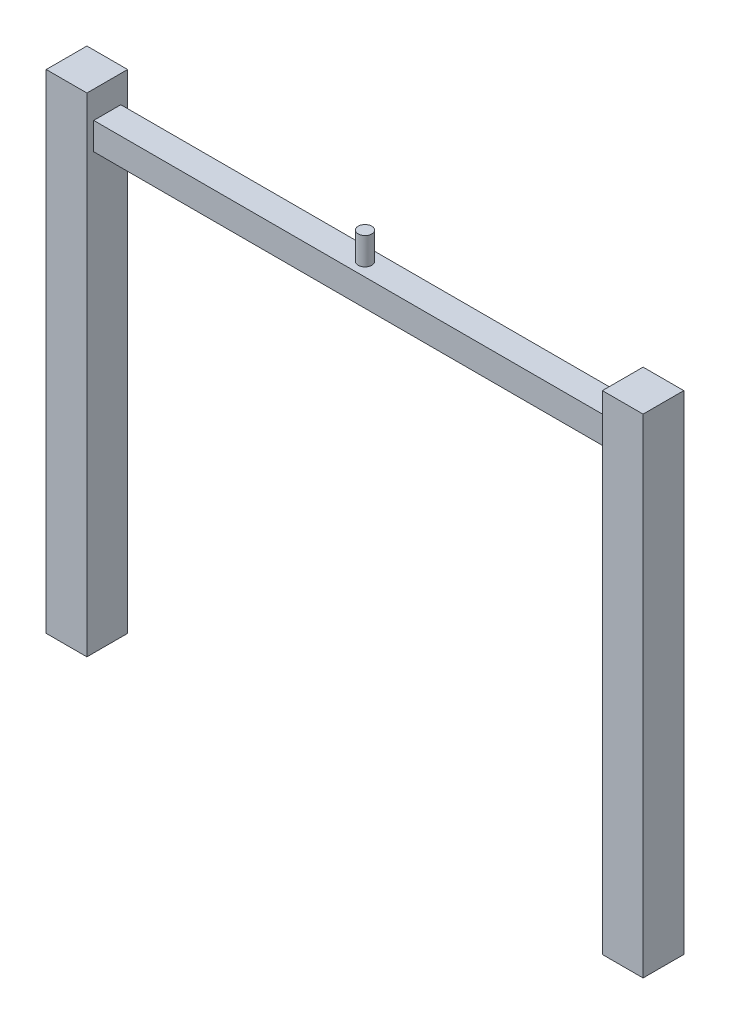
ISO-10303-21;
HEADER;
FILE_DESCRIPTION(('STEP AP214'),'2;1');
FILE_NAME('part.step','',(''),(''),'','','');
FILE_SCHEMA(('AUTOMOTIVE_DESIGN { 1 0 10303 214 1 1 1 1 }'));
ENDSEC;
DATA;
#1=APPLICATION_CONTEXT('core data for automotive mechanical design processes');
#2=APPLICATION_PROTOCOL_DEFINITION('international standard','automotive_design',2000,#1);
#3=PRODUCT_CONTEXT('',#1,'mechanical');
#4=PRODUCT('Part','Part','',(#3));
#5=PRODUCT_RELATED_PRODUCT_CATEGORY('part','',(#4));
#6=PRODUCT_DEFINITION_FORMATION('','',#4);
#7=PRODUCT_DEFINITION_CONTEXT('part definition',#1,'design');
#8=PRODUCT_DEFINITION('design','',#6,#7);
#9=PRODUCT_DEFINITION_SHAPE('','',#8);
#10=(LENGTH_UNIT() NAMED_UNIT(*) SI_UNIT(.MILLI.,.METRE.));
#11=(NAMED_UNIT(*) PLANE_ANGLE_UNIT() SI_UNIT($,.RADIAN.));
#12=(NAMED_UNIT(*) SI_UNIT($,.STERADIAN.) SOLID_ANGLE_UNIT());
#13=UNCERTAINTY_MEASURE_WITH_UNIT(LENGTH_MEASURE(1.E-05),#10,'distance_accuracy_value','');
#14=(GEOMETRIC_REPRESENTATION_CONTEXT(3) GLOBAL_UNCERTAINTY_ASSIGNED_CONTEXT((#13)) GLOBAL_UNIT_ASSIGNED_CONTEXT((#10,
#11,#12)) REPRESENTATION_CONTEXT('',''));
#15=CARTESIAN_POINT('',(0.,0.,0.));
#16=DIRECTION('',(0.,0.,1.));
#17=DIRECTION('',(1.,0.,0.));
#18=AXIS2_PLACEMENT_3D('',#15,#16,#17);
#19=CARTESIAN_POINT('',(-242.569999999999,431.8,-12.7));
#20=DIRECTION('',(0.,0.,-1.));
#21=DIRECTION('',(0.,1.,0.));
#22=AXIS2_PLACEMENT_3D('',#19,#20,#21);
#23=PLANE('',#22);
#24=DIRECTION('',(1.,0.,0.));
#25=VECTOR('',#24,1.);
#26=CARTESIAN_POINT('',(-242.569999999999,431.8,-12.7));
#27=LINE('',#26,#25);
#28=CARTESIAN_POINT('',(-241.299999999999,431.8,-12.7));
#29=VERTEX_POINT('',#28);
#30=CARTESIAN_POINT('',(241.300000000001,431.8,-12.7));
#31=VERTEX_POINT('',#30);
#32=EDGE_CURVE('E57',#29,#31,#27,.T.);
#33=ORIENTED_EDGE('',*,*,#32,.T.);
#34=DIRECTION('',(0.,-1.,0.));
#35=VECTOR('',#34,1.);
#36=CARTESIAN_POINT('',(241.300000000001,431.8,-12.7));
#37=LINE('',#36,#35);
#38=CARTESIAN_POINT('',(241.300000000001,406.4,-12.7));
#39=VERTEX_POINT('',#38);
#40=EDGE_CURVE('E51',#31,#39,#37,.T.);
#41=ORIENTED_EDGE('',*,*,#40,.T.);
#42=DIRECTION('',(1.,0.,0.));
#43=VECTOR('',#42,1.);
#44=CARTESIAN_POINT('',(-242.569999999999,406.4,-12.7));
#45=LINE('',#44,#43);
#46=CARTESIAN_POINT('',(-241.299999999999,406.4,-12.7));
#47=VERTEX_POINT('',#46);
#48=EDGE_CURVE('E161',#47,#39,#45,.T.);
#49=ORIENTED_EDGE('',*,*,#48,.F.);
#50=DIRECTION('',(0.,-1.,0.));
#51=VECTOR('',#50,1.);
#52=CARTESIAN_POINT('',(-241.299999999999,457.2,-12.7));
#53=LINE('',#52,#51);
#54=EDGE_CURVE('E44',#29,#47,#53,.T.);
#55=ORIENTED_EDGE('',*,*,#54,.F.);
#56=EDGE_LOOP('',(#33,#41,#49,#55));
#57=FACE_BOUND('',#56,.T.);
#58=ADVANCED_FACE('F36',(#57),#23,.T.);
#59=CARTESIAN_POINT('',(-242.569999999999,406.4,12.7));
#60=DIRECTION('',(0.,-1.,0.));
#61=DIRECTION('',(0.,0.,-1.));
#62=AXIS2_PLACEMENT_3D('',#59,#60,#61);
#63=PLANE('',#62);
#64=ORIENTED_EDGE('',*,*,#48,.T.);
#65=DIRECTION('',(0.,0.,1.));
#66=VECTOR('',#65,1.);
#67=CARTESIAN_POINT('',(241.300000000001,406.4,12.7));
#68=LINE('',#67,#66);
#69=CARTESIAN_POINT('',(241.300000000001,406.4,12.7));
#70=VERTEX_POINT('',#69);
#71=EDGE_CURVE('E152',#39,#70,#68,.T.);
#72=ORIENTED_EDGE('',*,*,#71,.T.);
#73=DIRECTION('',(1.,0.,0.));
#74=VECTOR('',#73,1.);
#75=CARTESIAN_POINT('',(-242.569999999999,406.4,12.7));
#76=LINE('',#75,#74);
#77=CARTESIAN_POINT('',(-241.299999999999,406.4,12.7));
#78=VERTEX_POINT('',#77);
#79=EDGE_CURVE('E165',#78,#70,#76,.T.);
#80=ORIENTED_EDGE('',*,*,#79,.F.);
#81=DIRECTION('',(0.,0.,1.));
#82=VECTOR('',#81,1.);
#83=CARTESIAN_POINT('',(-241.299999999999,406.4,-19.05));
#84=LINE('',#83,#82);
#85=EDGE_CURVE('E207',#47,#78,#84,.T.);
#86=ORIENTED_EDGE('',*,*,#85,.F.);
#87=EDGE_LOOP('',(#64,#72,#80,#86));
#88=FACE_BOUND('',#87,.T.);
#89=ADVANCED_FACE('F215',(#88),#63,.T.);
#90=CARTESIAN_POINT('',(-242.569999999999,431.8,12.7));
#91=DIRECTION('',(0.,0.,1.));
#92=DIRECTION('',(0.,-1.,0.));
#93=AXIS2_PLACEMENT_3D('',#90,#91,#92);
#94=PLANE('',#93);
#95=ORIENTED_EDGE('',*,*,#79,.T.);
#96=DIRECTION('',(0.,1.,0.));
#97=VECTOR('',#96,1.);
#98=CARTESIAN_POINT('',(241.300000000001,431.8,12.7));
#99=LINE('',#98,#97);
#100=CARTESIAN_POINT('',(241.300000000001,431.8,12.7));
#101=VERTEX_POINT('',#100);
#102=EDGE_CURVE('E149',#70,#101,#99,.T.);
#103=ORIENTED_EDGE('',*,*,#102,.T.);
#104=DIRECTION('',(1.,0.,0.));
#105=VECTOR('',#104,1.);
#106=CARTESIAN_POINT('',(-242.569999999999,431.8,12.7));
#107=LINE('',#106,#105);
#108=CARTESIAN_POINT('',(-241.299999999999,431.8,12.7));
#109=VERTEX_POINT('',#108);
#110=EDGE_CURVE('E168',#109,#101,#107,.T.);
#111=ORIENTED_EDGE('',*,*,#110,.F.);
#112=DIRECTION('',(0.,1.,0.));
#113=VECTOR('',#112,1.);
#114=CARTESIAN_POINT('',(-241.299999999999,457.2,12.7));
#115=LINE('',#114,#113);
#116=EDGE_CURVE('E204',#78,#109,#115,.T.);
#117=ORIENTED_EDGE('',*,*,#116,.F.);
#118=EDGE_LOOP('',(#95,#103,#111,#117));
#119=FACE_BOUND('',#118,.T.);
#120=ADVANCED_FACE('F218',(#119),#94,.T.);
#121=CARTESIAN_POINT('',(-242.569999999999,431.8,12.7));
#122=DIRECTION('',(0.,1.,0.));
#123=DIRECTION('',(0.,0.,1.));
#124=AXIS2_PLACEMENT_3D('',#121,#122,#123);
#125=PLANE('',#124);
#126=CARTESIAN_POINT('',(0.,431.8,0.));
#127=DIRECTION('',(0.,1.,0.));
#128=DIRECTION('',(0.,0.,1.));
#129=AXIS2_PLACEMENT_3D('',#126,#127,#128);
#130=CIRCLE('',#129,6.35);
#131=CARTESIAN_POINT('',(0.,431.8,6.35));
#132=VERTEX_POINT('',#131);
#133=EDGE_CURVE('E245',#132,#132,#130,.T.);
#134=ORIENTED_EDGE('',*,*,#133,.F.);
#135=EDGE_LOOP('',(#134));
#136=FACE_BOUND('',#135,.T.);
#137=ORIENTED_EDGE('',*,*,#110,.T.);
#138=DIRECTION('',(0.,0.,-1.));
#139=VECTOR('',#138,1.);
#140=CARTESIAN_POINT('',(241.300000000001,431.8,12.7));
#141=LINE('',#140,#139);
#142=EDGE_CURVE('E11',#101,#31,#141,.T.);
#143=ORIENTED_EDGE('',*,*,#142,.T.);
#144=ORIENTED_EDGE('',*,*,#32,.F.);
#145=DIRECTION('',(0.,0.,-1.));
#146=VECTOR('',#145,1.);
#147=CARTESIAN_POINT('',(-241.299999999999,431.8,-19.05));
#148=LINE('',#147,#146);
#149=EDGE_CURVE('E201',#109,#29,#148,.T.);
#150=ORIENTED_EDGE('',*,*,#149,.F.);
#151=EDGE_LOOP('',(#137,#143,#144,#150));
#152=FACE_BOUND('',#151,.T.);
#153=ADVANCED_FACE('F220',(#136,#152),#125,.T.);
#154=CARTESIAN_POINT('',(-241.299999999999,457.2,-19.05));
#155=DIRECTION('',(-1.,0.,0.));
#156=DIRECTION('',(0.,0.,1.));
#157=AXIS2_PLACEMENT_3D('',#154,#155,#156);
#158=PLANE('',#157);
#159=ORIENTED_EDGE('',*,*,#149,.T.);
#160=ORIENTED_EDGE('',*,*,#54,.T.);
#161=ORIENTED_EDGE('',*,*,#85,.T.);
#162=ORIENTED_EDGE('',*,*,#116,.T.);
#163=EDGE_LOOP('',(#159,#160,#161,#162));
#164=FACE_BOUND('',#163,.T.);
#165=DIRECTION('',(0.,0.,-1.));
#166=VECTOR('',#165,1.);
#167=CARTESIAN_POINT('',(-241.299999999999,0.,-19.05));
#168=LINE('',#167,#166);
#169=CARTESIAN_POINT('',(-241.299999999999,0.,19.05));
#170=VERTEX_POINT('',#169);
#171=CARTESIAN_POINT('',(-241.299999999999,0.,-19.05));
#172=VERTEX_POINT('',#171);
#173=EDGE_CURVE('E164',#170,#172,#168,.T.);
#174=ORIENTED_EDGE('',*,*,#173,.T.);
#175=DIRECTION('',(0.,-1.,0.));
#176=VECTOR('',#175,1.);
#177=CARTESIAN_POINT('',(-241.299999999999,457.2,-19.05));
#178=LINE('',#177,#176);
#179=CARTESIAN_POINT('',(-241.299999999999,457.2,-19.05));
#180=VERTEX_POINT('',#179);
#181=EDGE_CURVE('E198',#180,#172,#178,.T.);
#182=ORIENTED_EDGE('',*,*,#181,.F.);
#183=DIRECTION('',(0.,0.,-1.));
#184=VECTOR('',#183,1.);
#185=CARTESIAN_POINT('',(-241.299999999999,457.2,-19.05));
#186=LINE('',#185,#184);
#187=CARTESIAN_POINT('',(-241.299999999999,457.2,19.05));
#188=VERTEX_POINT('',#187);
#189=EDGE_CURVE('E172',#188,#180,#186,.T.);
#190=ORIENTED_EDGE('',*,*,#189,.F.);
#191=DIRECTION('',(0.,-1.,0.));
#192=VECTOR('',#191,1.);
#193=CARTESIAN_POINT('',(-241.299999999999,457.2,19.05));
#194=LINE('',#193,#192);
#195=EDGE_CURVE('E182',#188,#170,#194,.T.);
#196=ORIENTED_EDGE('',*,*,#195,.T.);
#197=EDGE_LOOP('',(#174,#182,#190,#196));
#198=FACE_BOUND('',#197,.T.);
#199=ADVANCED_FACE('F38',(#164,#198),#158,.F.);
#200=CARTESIAN_POINT('',(-279.400000000003,457.2,-19.05));
#201=DIRECTION('',(0.,0.,1.));
#202=DIRECTION('',(1.,0.,0.));
#203=AXIS2_PLACEMENT_3D('',#200,#201,#202);
#204=PLANE('',#203);
#205=DIRECTION('',(-1.,0.,0.));
#206=VECTOR('',#205,1.);
#207=CARTESIAN_POINT('',(-279.400000000003,0.,-19.05));
#208=LINE('',#207,#206);
#209=CARTESIAN_POINT('',(-279.400000000003,0.,-19.05));
#210=VERTEX_POINT('',#209);
#211=EDGE_CURVE('E185',#172,#210,#208,.T.);
#212=ORIENTED_EDGE('',*,*,#211,.T.);
#213=DIRECTION('',(0.,-1.,0.));
#214=VECTOR('',#213,1.);
#215=CARTESIAN_POINT('',(-279.400000000003,457.2,-19.05));
#216=LINE('',#215,#214);
#217=CARTESIAN_POINT('',(-279.400000000003,457.2,-19.05));
#218=VERTEX_POINT('',#217);
#219=EDGE_CURVE('E195',#218,#210,#216,.T.);
#220=ORIENTED_EDGE('',*,*,#219,.F.);
#221=DIRECTION('',(-1.,0.,0.));
#222=VECTOR('',#221,1.);
#223=CARTESIAN_POINT('',(-279.400000000003,457.2,-19.05));
#224=LINE('',#223,#222);
#225=EDGE_CURVE('E175',#180,#218,#224,.T.);
#226=ORIENTED_EDGE('',*,*,#225,.F.);
#227=ORIENTED_EDGE('',*,*,#181,.T.);
#228=EDGE_LOOP('',(#212,#220,#226,#227));
#229=FACE_BOUND('',#228,.T.);
#230=ADVANCED_FACE('F261',(#229),#204,.F.);
#231=CARTESIAN_POINT('',(-279.400000000003,457.2,-19.05));
#232=DIRECTION('',(1.,0.,0.));
#233=DIRECTION('',(0.,0.,-1.));
#234=AXIS2_PLACEMENT_3D('',#231,#232,#233);
#235=PLANE('',#234);
#236=DIRECTION('',(0.,0.,1.));
#237=VECTOR('',#236,1.);
#238=CARTESIAN_POINT('',(-279.400000000003,0.,-19.05));
#239=LINE('',#238,#237);
#240=CARTESIAN_POINT('',(-279.400000000003,0.,19.05));
#241=VERTEX_POINT('',#240);
#242=EDGE_CURVE('E187',#210,#241,#239,.T.);
#243=ORIENTED_EDGE('',*,*,#242,.T.);
#244=DIRECTION('',(0.,-1.,0.));
#245=VECTOR('',#244,1.);
#246=CARTESIAN_POINT('',(-279.400000000003,457.2,19.05));
#247=LINE('',#246,#245);
#248=CARTESIAN_POINT('',(-279.400000000003,457.2,19.05));
#249=VERTEX_POINT('',#248);
#250=EDGE_CURVE('E192',#249,#241,#247,.T.);
#251=ORIENTED_EDGE('',*,*,#250,.F.);
#252=DIRECTION('',(0.,0.,1.));
#253=VECTOR('',#252,1.);
#254=CARTESIAN_POINT('',(-279.400000000003,457.2,-19.05));
#255=LINE('',#254,#253);
#256=EDGE_CURVE('E178',#218,#249,#255,.T.);
#257=ORIENTED_EDGE('',*,*,#256,.F.);
#258=ORIENTED_EDGE('',*,*,#219,.T.);
#259=EDGE_LOOP('',(#243,#251,#257,#258));
#260=FACE_BOUND('',#259,.T.);
#261=ADVANCED_FACE('F281',(#260),#235,.F.);
#262=CARTESIAN_POINT('',(-279.400000000003,457.2,19.05));
#263=DIRECTION('',(0.,0.,-1.));
#264=DIRECTION('',(-1.,0.,0.));
#265=AXIS2_PLACEMENT_3D('',#262,#263,#264);
#266=PLANE('',#265);
#267=DIRECTION('',(1.,0.,0.));
#268=VECTOR('',#267,1.);
#269=CARTESIAN_POINT('',(-279.400000000003,0.,19.05));
#270=LINE('',#269,#268);
#271=EDGE_CURVE('E176',#241,#170,#270,.T.);
#272=ORIENTED_EDGE('',*,*,#271,.T.);
#273=ORIENTED_EDGE('',*,*,#195,.F.);
#274=DIRECTION('',(1.,0.,0.));
#275=VECTOR('',#274,1.);
#276=CARTESIAN_POINT('',(-279.400000000003,457.2,19.05));
#277=LINE('',#276,#275);
#278=EDGE_CURVE('E180',#249,#188,#277,.T.);
#279=ORIENTED_EDGE('',*,*,#278,.F.);
#280=ORIENTED_EDGE('',*,*,#250,.T.);
#281=EDGE_LOOP('',(#272,#273,#279,#280));
#282=FACE_BOUND('',#281,.T.);
#283=ADVANCED_FACE('F274',(#282),#266,.F.);
#284=CARTESIAN_POINT('',(0.,457.2,0.));
#285=DIRECTION('',(0.,1.,0.));
#286=DIRECTION('',(0.,0.,1.));
#287=AXIS2_PLACEMENT_3D('',#284,#285,#286);
#288=PLANE('',#287);
#289=ORIENTED_EDGE('',*,*,#189,.T.);
#290=ORIENTED_EDGE('',*,*,#225,.T.);
#291=ORIENTED_EDGE('',*,*,#256,.T.);
#292=ORIENTED_EDGE('',*,*,#278,.T.);
#293=EDGE_LOOP('',(#289,#290,#291,#292));
#294=FACE_BOUND('',#293,.T.);
#295=ADVANCED_FACE('F270',(#294),#288,.T.);
#296=CARTESIAN_POINT('',(0.,0.,0.));
#297=DIRECTION('',(0.,1.,0.));
#298=DIRECTION('',(0.,0.,1.));
#299=AXIS2_PLACEMENT_3D('',#296,#297,#298);
#300=PLANE('',#299);
#301=ORIENTED_EDGE('',*,*,#173,.F.);
#302=ORIENTED_EDGE('',*,*,#271,.F.);
#303=ORIENTED_EDGE('',*,*,#242,.F.);
#304=ORIENTED_EDGE('',*,*,#211,.F.);
#305=EDGE_LOOP('',(#301,#302,#303,#304));
#306=FACE_BOUND('',#305,.T.);
#307=ADVANCED_FACE('F273',(#306),#300,.F.);
#308=CARTESIAN_POINT('',(241.300000000001,457.2,-19.05));
#309=DIRECTION('',(0.,0.,1.));
#310=DIRECTION('',(1.,0.,0.));
#311=AXIS2_PLACEMENT_3D('',#308,#309,#310);
#312=PLANE('',#311);
#313=DIRECTION('',(-1.,0.,0.));
#314=VECTOR('',#313,1.);
#315=CARTESIAN_POINT('',(241.300000000001,0.,-19.05));
#316=LINE('',#315,#314);
#317=CARTESIAN_POINT('',(279.400000000001,0.,-19.05));
#318=VERTEX_POINT('',#317);
#319=CARTESIAN_POINT('',(241.300000000001,0.,-19.05));
#320=VERTEX_POINT('',#319);
#321=EDGE_CURVE('E232',#318,#320,#316,.T.);
#322=ORIENTED_EDGE('',*,*,#321,.T.);
#323=DIRECTION('',(0.,-1.,0.));
#324=VECTOR('',#323,1.);
#325=CARTESIAN_POINT('',(241.300000000001,457.2,-19.05));
#326=LINE('',#325,#324);
#327=CARTESIAN_POINT('',(241.300000000001,457.2,-19.05));
#328=VERTEX_POINT('',#327);
#329=EDGE_CURVE('E131',#328,#320,#326,.T.);
#330=ORIENTED_EDGE('',*,*,#329,.F.);
#331=DIRECTION('',(-1.,0.,0.));
#332=VECTOR('',#331,1.);
#333=CARTESIAN_POINT('',(241.300000000001,457.2,-19.05));
#334=LINE('',#333,#332);
#335=CARTESIAN_POINT('',(279.400000000001,457.2,-19.05));
#336=VERTEX_POINT('',#335);
#337=EDGE_CURVE('E124',#336,#328,#334,.T.);
#338=ORIENTED_EDGE('',*,*,#337,.F.);
#339=DIRECTION('',(0.,-1.,0.));
#340=VECTOR('',#339,1.);
#341=CARTESIAN_POINT('',(279.400000000001,457.2,-19.05));
#342=LINE('',#341,#340);
#343=EDGE_CURVE('E128',#336,#318,#342,.T.);
#344=ORIENTED_EDGE('',*,*,#343,.T.);
#345=EDGE_LOOP('',(#322,#330,#338,#344));
#346=FACE_BOUND('',#345,.T.);
#347=ADVANCED_FACE('F126',(#346),#312,.F.);
#348=CARTESIAN_POINT('',(241.300000000001,457.2,-19.05));
#349=DIRECTION('',(1.,0.,0.));
#350=DIRECTION('',(0.,0.,-1.));
#351=AXIS2_PLACEMENT_3D('',#348,#349,#350);
#352=PLANE('',#351);
#353=ORIENTED_EDGE('',*,*,#40,.F.);
#354=ORIENTED_EDGE('',*,*,#142,.F.);
#355=ORIENTED_EDGE('',*,*,#102,.F.);
#356=ORIENTED_EDGE('',*,*,#71,.F.);
#357=EDGE_LOOP('',(#353,#354,#355,#356));
#358=FACE_BOUND('',#357,.T.);
#359=DIRECTION('',(0.,0.,1.));
#360=VECTOR('',#359,1.);
#361=CARTESIAN_POINT('',(241.300000000001,0.,-19.05));
#362=LINE('',#361,#360);
#363=CARTESIAN_POINT('',(241.300000000001,0.,19.05));
#364=VERTEX_POINT('',#363);
#365=EDGE_CURVE('E228',#320,#364,#362,.T.);
#366=ORIENTED_EDGE('',*,*,#365,.T.);
#367=DIRECTION('',(0.,-1.,0.));
#368=VECTOR('',#367,1.);
#369=CARTESIAN_POINT('',(241.300000000001,457.2,19.05));
#370=LINE('',#369,#368);
#371=CARTESIAN_POINT('',(241.300000000001,457.2,19.05));
#372=VERTEX_POINT('',#371);
#373=EDGE_CURVE('E154',#372,#364,#370,.T.);
#374=ORIENTED_EDGE('',*,*,#373,.F.);
#375=DIRECTION('',(0.,0.,1.));
#376=VECTOR('',#375,1.);
#377=CARTESIAN_POINT('',(241.300000000001,457.2,-19.05));
#378=LINE('',#377,#376);
#379=EDGE_CURVE('E134',#328,#372,#378,.T.);
#380=ORIENTED_EDGE('',*,*,#379,.F.);
#381=ORIENTED_EDGE('',*,*,#329,.T.);
#382=EDGE_LOOP('',(#366,#374,#380,#381));
#383=FACE_BOUND('',#382,.T.);
#384=ADVANCED_FACE('F221',(#358,#383),#352,.F.);
#385=CARTESIAN_POINT('',(241.300000000001,457.2,19.05));
#386=DIRECTION('',(0.,0.,-1.));
#387=DIRECTION('',(-1.,0.,0.));
#388=AXIS2_PLACEMENT_3D('',#385,#386,#387);
#389=PLANE('',#388);
#390=DIRECTION('',(1.,0.,0.));
#391=VECTOR('',#390,1.);
#392=CARTESIAN_POINT('',(241.300000000001,0.,19.05));
#393=LINE('',#392,#391);
#394=CARTESIAN_POINT('',(279.400000000001,0.,19.05));
#395=VERTEX_POINT('',#394);
#396=EDGE_CURVE('E144',#364,#395,#393,.T.);
#397=ORIENTED_EDGE('',*,*,#396,.T.);
#398=DIRECTION('',(0.,-1.,0.));
#399=VECTOR('',#398,1.);
#400=CARTESIAN_POINT('',(279.400000000001,457.2,19.05));
#401=LINE('',#400,#399);
#402=CARTESIAN_POINT('',(279.400000000001,457.2,19.05));
#403=VERTEX_POINT('',#402);
#404=EDGE_CURVE('E235',#403,#395,#401,.T.);
#405=ORIENTED_EDGE('',*,*,#404,.F.);
#406=DIRECTION('',(1.,0.,0.));
#407=VECTOR('',#406,1.);
#408=CARTESIAN_POINT('',(241.300000000001,457.2,19.05));
#409=LINE('',#408,#407);
#410=EDGE_CURVE('E140',#372,#403,#409,.T.);
#411=ORIENTED_EDGE('',*,*,#410,.F.);
#412=ORIENTED_EDGE('',*,*,#373,.T.);
#413=EDGE_LOOP('',(#397,#405,#411,#412));
#414=FACE_BOUND('',#413,.T.);
#415=ADVANCED_FACE('F224',(#414),#389,.F.);
#416=CARTESIAN_POINT('',(0.,457.2,0.));
#417=DIRECTION('',(0.,1.,0.));
#418=DIRECTION('',(0.,0.,1.));
#419=AXIS2_PLACEMENT_3D('',#416,#417,#418);
#420=PLANE('',#419);
#421=DIRECTION('',(0.,0.,-1.));
#422=VECTOR('',#421,1.);
#423=CARTESIAN_POINT('',(279.400000000001,457.2,-19.05));
#424=LINE('',#423,#422);
#425=EDGE_CURVE('E135',#403,#336,#424,.T.);
#426=ORIENTED_EDGE('',*,*,#425,.T.);
#427=ORIENTED_EDGE('',*,*,#337,.T.);
#428=ORIENTED_EDGE('',*,*,#379,.T.);
#429=ORIENTED_EDGE('',*,*,#410,.T.);
#430=EDGE_LOOP('',(#426,#427,#428,#429));
#431=FACE_BOUND('',#430,.T.);
#432=ADVANCED_FACE('F138',(#431),#420,.T.);
#433=CARTESIAN_POINT('',(0.,0.,0.));
#434=DIRECTION('',(0.,1.,0.));
#435=DIRECTION('',(0.,0.,1.));
#436=AXIS2_PLACEMENT_3D('',#433,#434,#435);
#437=PLANE('',#436);
#438=DIRECTION('',(0.,0.,-1.));
#439=VECTOR('',#438,1.);
#440=CARTESIAN_POINT('',(279.400000000001,0.,-19.05));
#441=LINE('',#440,#439);
#442=EDGE_CURVE('E148',#395,#318,#441,.T.);
#443=ORIENTED_EDGE('',*,*,#442,.F.);
#444=ORIENTED_EDGE('',*,*,#396,.F.);
#445=ORIENTED_EDGE('',*,*,#365,.F.);
#446=ORIENTED_EDGE('',*,*,#321,.F.);
#447=EDGE_LOOP('',(#443,#444,#445,#446));
#448=FACE_BOUND('',#447,.T.);
#449=ADVANCED_FACE('F236',(#448),#437,.F.);
#450=CARTESIAN_POINT('',(279.400000000001,0.,0.));
#451=DIRECTION('',(1.,0.,0.));
#452=DIRECTION('',(0.,0.,-1.));
#453=AXIS2_PLACEMENT_3D('',#450,#451,#452);
#454=PLANE('',#453);
#455=ORIENTED_EDGE('',*,*,#442,.T.);
#456=ORIENTED_EDGE('',*,*,#343,.F.);
#457=ORIENTED_EDGE('',*,*,#425,.F.);
#458=ORIENTED_EDGE('',*,*,#404,.T.);
#459=EDGE_LOOP('',(#455,#456,#457,#458));
#460=FACE_BOUND('',#459,.T.);
#461=ADVANCED_FACE('F146',(#460),#454,.T.);
#462=CARTESIAN_POINT('',(0.,457.2,0.));
#463=DIRECTION('',(0.,-1.,0.));
#464=DIRECTION('',(0.,0.,-1.));
#465=AXIS2_PLACEMENT_3D('',#462,#463,#464);
#466=CYLINDRICAL_SURFACE('',#465,6.35);
#467=CARTESIAN_POINT('',(0.,457.2,0.));
#468=DIRECTION('',(0.,1.,0.));
#469=DIRECTION('',(0.,0.,1.));
#470=AXIS2_PLACEMENT_3D('',#467,#468,#469);
#471=CIRCLE('',#470,6.35);
#472=CARTESIAN_POINT('',(0.,457.2,6.35));
#473=VERTEX_POINT('',#472);
#474=EDGE_CURVE('E243',#473,#473,#471,.T.);
#475=ORIENTED_EDGE('',*,*,#474,.F.);
#476=EDGE_LOOP('',(#475));
#477=FACE_BOUND('',#476,.T.);
#478=ORIENTED_EDGE('',*,*,#133,.T.);
#479=EDGE_LOOP('',(#478));
#480=FACE_BOUND('',#479,.T.);
#481=ADVANCED_FACE('F253',(#477,#480),#466,.T.);
#482=CARTESIAN_POINT('',(0.,457.2,0.));
#483=DIRECTION('',(0.,1.,0.));
#484=DIRECTION('',(0.,0.,1.));
#485=AXIS2_PLACEMENT_3D('',#482,#483,#484);
#486=PLANE('',#485);
#487=ORIENTED_EDGE('',*,*,#474,.T.);
#488=EDGE_LOOP('',(#487));
#489=FACE_BOUND('',#488,.T.);
#490=ADVANCED_FACE('F357',(#489),#486,.T.);
#491=CLOSED_SHELL('',(#58,#89,#120,#153,#199,#230,#261,#283,#295,#307,#347,#384,#415,#432,#449,
#461,#481,#490));
#492=MANIFOLD_SOLID_BREP('B2',#491);
#493=ADVANCED_BREP_SHAPE_REPRESENTATION('',(#18,#492),#14);
#494=SHAPE_DEFINITION_REPRESENTATION(#9,#493);
ENDSEC;
END-ISO-10303-21;
